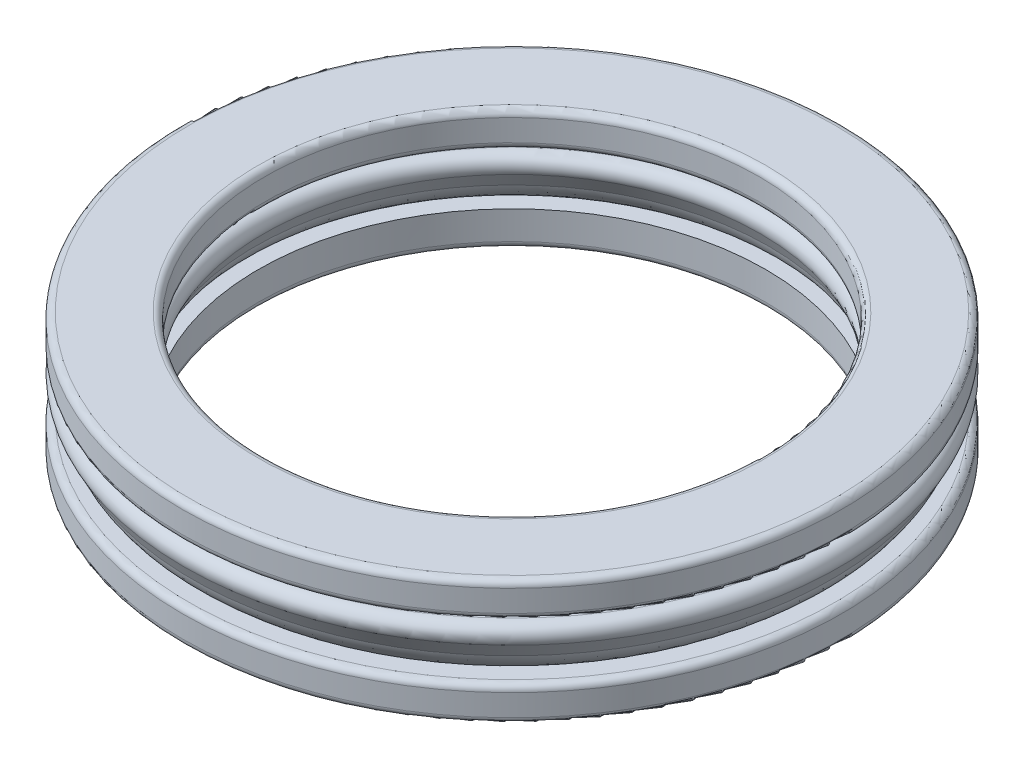
ISO-10303-21;
HEADER;
FILE_DESCRIPTION(('STEP AP214'),'2;1');
FILE_NAME('part.step','',(''),(''),'','','');
FILE_SCHEMA(('AUTOMOTIVE_DESIGN { 1 0 10303 214 1 1 1 1 }'));
ENDSEC;
DATA;
#1=APPLICATION_CONTEXT('core data for automotive mechanical design processes');
#2=APPLICATION_PROTOCOL_DEFINITION('international standard','automotive_design',2000,#1);
#3=PRODUCT_CONTEXT('',#1,'mechanical');
#4=PRODUCT('Part','Part','',(#3));
#5=PRODUCT_RELATED_PRODUCT_CATEGORY('part','',(#4));
#6=PRODUCT_DEFINITION_FORMATION('','',#4);
#7=PRODUCT_DEFINITION_CONTEXT('part definition',#1,'design');
#8=PRODUCT_DEFINITION('design','',#6,#7);
#9=PRODUCT_DEFINITION_SHAPE('','',#8);
#10=(LENGTH_UNIT() NAMED_UNIT(*) SI_UNIT(.MILLI.,.METRE.));
#11=(NAMED_UNIT(*) PLANE_ANGLE_UNIT() SI_UNIT($,.RADIAN.));
#12=(NAMED_UNIT(*) SI_UNIT($,.STERADIAN.) SOLID_ANGLE_UNIT());
#13=UNCERTAINTY_MEASURE_WITH_UNIT(LENGTH_MEASURE(1.E-05),#10,'distance_accuracy_value','');
#14=(GEOMETRIC_REPRESENTATION_CONTEXT(3) GLOBAL_UNCERTAINTY_ASSIGNED_CONTEXT((#13)) GLOBAL_UNIT_ASSIGNED_CONTEXT((#10,
#11,#12)) REPRESENTATION_CONTEXT('',''));
#15=CARTESIAN_POINT('',(0.,0.,0.));
#16=DIRECTION('',(0.,0.,1.));
#17=DIRECTION('',(1.,0.,0.));
#18=AXIS2_PLACEMENT_3D('',#15,#16,#17);
#19=CARTESIAN_POINT('',(0.,0.,0.));
#20=DIRECTION('',(0.,-1.,0.));
#21=DIRECTION('',(0.,0.,-1.));
#22=AXIS2_PLACEMENT_3D('',#19,#20,#21);
#23=CYLINDRICAL_SURFACE('',#22,50.);
#24=CARTESIAN_POINT('',(0.,1.,0.));
#25=DIRECTION('',(0.,1.,0.));
#26=DIRECTION('',(0.,0.,1.));
#27=AXIS2_PLACEMENT_3D('',#24,#25,#26);
#28=CIRCLE('',#27,50.);
#29=CARTESIAN_POINT('',(0.,1.,50.));
#30=VERTEX_POINT('',#29);
#31=EDGE_CURVE('E66',#30,#30,#28,.T.);
#32=ORIENTED_EDGE('',*,*,#31,.T.);
#33=EDGE_LOOP('',(#32));
#34=FACE_BOUND('',#33,.T.);
#35=CARTESIAN_POINT('',(0.,4.3,0.));
#36=DIRECTION('',(0.,-1.,0.));
#37=DIRECTION('',(0.,0.,-1.));
#38=AXIS2_PLACEMENT_3D('',#35,#36,#37);
#39=CIRCLE('',#38,50.);
#40=CARTESIAN_POINT('',(0.,4.3,-50.));
#41=VERTEX_POINT('',#40);
#42=EDGE_CURVE('E69',#41,#41,#39,.T.);
#43=ORIENTED_EDGE('',*,*,#42,.T.);
#44=EDGE_LOOP('',(#43));
#45=FACE_BOUND('',#44,.T.);
#46=ADVANCED_FACE('F31',(#34,#45),#23,.T.);
#47=CARTESIAN_POINT('',(-50.,0.,0.));
#48=DIRECTION('',(0.,1.,0.));
#49=DIRECTION('',(0.,0.,1.));
#50=AXIS2_PLACEMENT_3D('',#47,#48,#49);
#51=PLANE('',#50);
#52=CARTESIAN_POINT('',(0.,0.,0.));
#53=DIRECTION('',(0.,1.,0.));
#54=DIRECTION('',(0.,0.,1.));
#55=AXIS2_PLACEMENT_3D('',#52,#53,#54);
#56=CIRCLE('',#55,39.5);
#57=CARTESIAN_POINT('',(0.,0.,39.5));
#58=VERTEX_POINT('',#57);
#59=EDGE_CURVE('E72',#58,#58,#56,.T.);
#60=ORIENTED_EDGE('',*,*,#59,.T.);
#61=EDGE_LOOP('',(#60));
#62=FACE_BOUND('',#61,.T.);
#63=CARTESIAN_POINT('',(0.,0.,0.));
#64=DIRECTION('',(0.,1.,0.));
#65=DIRECTION('',(0.,0.,1.));
#66=AXIS2_PLACEMENT_3D('',#63,#64,#65);
#67=CIRCLE('',#66,49.);
#68=CARTESIAN_POINT('',(0.,0.,49.));
#69=VERTEX_POINT('',#68);
#70=EDGE_CURVE('E75',#69,#69,#67,.F.);
#71=ORIENTED_EDGE('',*,*,#70,.T.);
#72=EDGE_LOOP('',(#71));
#73=FACE_BOUND('',#72,.T.);
#74=ADVANCED_FACE('F165',(#62,#73),#51,.F.);
#75=CARTESIAN_POINT('',(0.,0.,0.));
#76=DIRECTION('',(0.,-1.,0.));
#77=DIRECTION('',(0.,0.,-1.));
#78=AXIS2_PLACEMENT_3D('',#75,#76,#77);
#79=CYLINDRICAL_SURFACE('',#78,38.5);
#80=CARTESIAN_POINT('',(0.,1.,0.));
#81=DIRECTION('',(0.,1.,0.));
#82=DIRECTION('',(0.,0.,1.));
#83=AXIS2_PLACEMENT_3D('',#80,#81,#82);
#84=CIRCLE('',#83,38.5);
#85=CARTESIAN_POINT('',(0.,1.,38.5));
#86=VERTEX_POINT('',#85);
#87=EDGE_CURVE('E78',#86,#86,#84,.F.);
#88=ORIENTED_EDGE('',*,*,#87,.T.);
#89=EDGE_LOOP('',(#88));
#90=FACE_BOUND('',#89,.T.);
#91=CARTESIAN_POINT('',(0.,5.3,0.));
#92=DIRECTION('',(0.,-1.,0.));
#93=DIRECTION('',(0.,0.,-1.));
#94=AXIS2_PLACEMENT_3D('',#91,#92,#93);
#95=CIRCLE('',#94,38.5);
#96=CARTESIAN_POINT('',(0.,5.3,-38.5));
#97=VERTEX_POINT('',#96);
#98=EDGE_CURVE('E81',#97,#97,#95,.T.);
#99=ORIENTED_EDGE('',*,*,#98,.F.);
#100=EDGE_LOOP('',(#99));
#101=FACE_BOUND('',#100,.T.);
#102=ADVANCED_FACE('F171',(#90,#101),#79,.F.);
#103=CARTESIAN_POINT('',(-41.0741076254827,5.3,0.));
#104=DIRECTION('',(0.,-1.,0.));
#105=DIRECTION('',(0.,0.,-1.));
#106=AXIS2_PLACEMENT_3D('',#103,#104,#105);
#107=PLANE('',#106);
#108=CARTESIAN_POINT('',(0.,5.3,0.));
#109=DIRECTION('',(0.,-1.,0.));
#110=DIRECTION('',(0.,0.,-1.));
#111=AXIS2_PLACEMENT_3D('',#108,#109,#110);
#112=CIRCLE('',#111,41.0741076254827);
#113=CARTESIAN_POINT('',(0.,5.3,-41.0741076254827));
#114=VERTEX_POINT('',#113);
#115=EDGE_CURVE('E84',#114,#114,#112,.T.);
#116=ORIENTED_EDGE('',*,*,#115,.F.);
#117=EDGE_LOOP('',(#116));
#118=FACE_BOUND('',#117,.T.);
#119=ORIENTED_EDGE('',*,*,#98,.T.);
#120=EDGE_LOOP('',(#119));
#121=FACE_BOUND('',#120,.T.);
#122=ADVANCED_FACE('F238',(#118,#121),#107,.F.);
#123=CARTESIAN_POINT('',(0.,9.5,0.));
#124=DIRECTION('',(0.,-1.,0.));
#125=DIRECTION('',(0.,0.,-1.));
#126=AXIS2_PLACEMENT_3D('',#123,#124,#125);
#127=TOROIDAL_SURFACE('',#126,43.75,4.98);
#128=CARTESIAN_POINT('',(0.,8.1,0.));
#129=DIRECTION('',(0.,-1.,0.));
#130=DIRECTION('',(0.,0.,-1.));
#131=AXIS2_PLACEMENT_3D('',#128,#129,#130);
#132=CIRCLE('',#131,38.9708368933463);
#133=CARTESIAN_POINT('',(0.,8.1,-38.9708368933463));
#134=VERTEX_POINT('',#133);
#135=EDGE_CURVE('E87',#134,#134,#132,.T.);
#136=ORIENTED_EDGE('',*,*,#135,.F.);
#137=EDGE_LOOP('',(#136));
#138=FACE_BOUND('',#137,.T.);
#139=ORIENTED_EDGE('',*,*,#115,.T.);
#140=EDGE_LOOP('',(#139));
#141=FACE_BOUND('',#140,.T.);
#142=ADVANCED_FACE('F234',(#138,#141),#127,.T.);
#143=CARTESIAN_POINT('',(0.,8.1,0.));
#144=DIRECTION('',(0.,-1.,0.));
#145=DIRECTION('',(0.,0.,-1.));
#146=AXIS2_PLACEMENT_3D('',#143,#144,#145);
#147=CONICAL_SURFACE('',#146,38.9708368933463,0.504861365675038);
#148=CARTESIAN_POINT('',(0.,10.3777336190306,0.));
#149=DIRECTION('',(0.,-1.,0.));
#150=DIRECTION('',(0.,0.,-1.));
#151=AXIS2_PLACEMENT_3D('',#148,#149,#150);
#152=CIRCLE('',#151,37.7120893848327);
#153=CARTESIAN_POINT('',(0.,10.3777336190306,-37.7120893848327));
#154=VERTEX_POINT('',#153);
#155=EDGE_CURVE('E90',#154,#154,#152,.T.);
#156=ORIENTED_EDGE('',*,*,#155,.F.);
#157=EDGE_LOOP('',(#156));
#158=FACE_BOUND('',#157,.T.);
#159=ORIENTED_EDGE('',*,*,#135,.T.);
#160=EDGE_LOOP('',(#159));
#161=FACE_BOUND('',#160,.T.);
#162=ADVANCED_FACE('F230',(#158,#161),#147,.F.);
#163=CARTESIAN_POINT('',(0.,11.2,0.));
#164=DIRECTION('',(0.,-1.,0.));
#165=DIRECTION('',(0.,0.,-1.));
#166=AXIS2_PLACEMENT_3D('',#163,#164,#165);
#167=TOROIDAL_SURFACE('',#166,39.2,1.69999999999999);
#168=CARTESIAN_POINT('',(0.,12.9,0.));
#169=DIRECTION('',(0.,-1.,0.));
#170=DIRECTION('',(0.,0.,-1.));
#171=AXIS2_PLACEMENT_3D('',#168,#169,#170);
#172=CIRCLE('',#171,39.2);
#173=CARTESIAN_POINT('',(0.,12.9,-39.2));
#174=VERTEX_POINT('',#173);
#175=EDGE_CURVE('E93',#174,#174,#172,.T.);
#176=ORIENTED_EDGE('',*,*,#175,.F.);
#177=EDGE_LOOP('',(#176));
#178=FACE_BOUND('',#177,.T.);
#179=ORIENTED_EDGE('',*,*,#155,.T.);
#180=EDGE_LOOP('',(#179));
#181=FACE_BOUND('',#180,.T.);
#182=ADVANCED_FACE('F226',(#178,#181),#167,.T.);
#183=CARTESIAN_POINT('',(-40.1112639557121,12.9,0.));
#184=DIRECTION('',(0.,-1.,0.));
#185=DIRECTION('',(0.,0.,-1.));
#186=AXIS2_PLACEMENT_3D('',#183,#184,#185);
#187=PLANE('',#186);
#188=CARTESIAN_POINT('',(0.,12.9,0.));
#189=DIRECTION('',(0.,-1.,0.));
#190=DIRECTION('',(0.,0.,-1.));
#191=AXIS2_PLACEMENT_3D('',#188,#189,#190);
#192=CIRCLE('',#191,40.1112639557121);
#193=CARTESIAN_POINT('',(0.,12.9,-40.1112639557121));
#194=VERTEX_POINT('',#193);
#195=EDGE_CURVE('E96',#194,#194,#192,.T.);
#196=ORIENTED_EDGE('',*,*,#195,.F.);
#197=EDGE_LOOP('',(#196));
#198=FACE_BOUND('',#197,.T.);
#199=ORIENTED_EDGE('',*,*,#175,.T.);
#200=EDGE_LOOP('',(#199));
#201=FACE_BOUND('',#200,.T.);
#202=ADVANCED_FACE('F222',(#198,#201),#187,.F.);
#203=CARTESIAN_POINT('',(0.,9.5,0.));
#204=DIRECTION('',(0.,-1.,0.));
#205=DIRECTION('',(0.,0.,-1.));
#206=AXIS2_PLACEMENT_3D('',#203,#204,#205);
#207=TOROIDAL_SURFACE('',#206,43.75,4.98);
#208=CARTESIAN_POINT('',(0.,13.7,0.));
#209=DIRECTION('',(0.,-1.,0.));
#210=DIRECTION('',(0.,0.,-1.));
#211=AXIS2_PLACEMENT_3D('',#208,#209,#210);
#212=CIRCLE('',#211,41.0741076254827);
#213=CARTESIAN_POINT('',(0.,13.7,-41.0741076254827));
#214=VERTEX_POINT('',#213);
#215=EDGE_CURVE('E99',#214,#214,#212,.T.);
#216=ORIENTED_EDGE('',*,*,#215,.F.);
#217=EDGE_LOOP('',(#216));
#218=FACE_BOUND('',#217,.T.);
#219=ORIENTED_EDGE('',*,*,#195,.T.);
#220=EDGE_LOOP('',(#219));
#221=FACE_BOUND('',#220,.T.);
#222=ADVANCED_FACE('F216',(#218,#221),#207,.T.);
#223=CARTESIAN_POINT('',(-41.0741076254827,13.7,0.));
#224=DIRECTION('',(0.,1.,0.));
#225=DIRECTION('',(0.,0.,1.));
#226=AXIS2_PLACEMENT_3D('',#223,#224,#225);
#227=PLANE('',#226);
#228=CARTESIAN_POINT('',(0.,13.7,0.));
#229=DIRECTION('',(0.,1.,0.));
#230=DIRECTION('',(0.,0.,1.));
#231=AXIS2_PLACEMENT_3D('',#228,#229,#230);
#232=CIRCLE('',#231,38.5);
#233=CARTESIAN_POINT('',(0.,13.7,38.5));
#234=VERTEX_POINT('',#233);
#235=EDGE_CURVE('E42',#234,#234,#232,.T.);
#236=ORIENTED_EDGE('',*,*,#235,.T.);
#237=EDGE_LOOP('',(#236));
#238=FACE_BOUND('',#237,.T.);
#239=ORIENTED_EDGE('',*,*,#215,.T.);
#240=EDGE_LOOP('',(#239));
#241=FACE_BOUND('',#240,.T.);
#242=ADVANCED_FACE('F208',(#238,#241),#227,.F.);
#243=CARTESIAN_POINT('',(0.,0.,0.));
#244=DIRECTION('',(0.,-1.,0.));
#245=DIRECTION('',(0.,0.,-1.));
#246=AXIS2_PLACEMENT_3D('',#243,#244,#245);
#247=CYLINDRICAL_SURFACE('',#246,37.5);
#248=CARTESIAN_POINT('',(0.,14.7,0.));
#249=DIRECTION('',(0.,1.,0.));
#250=DIRECTION('',(0.,0.,1.));
#251=AXIS2_PLACEMENT_3D('',#248,#249,#250);
#252=CIRCLE('',#251,37.5);
#253=CARTESIAN_POINT('',(0.,14.7,37.5));
#254=VERTEX_POINT('',#253);
#255=EDGE_CURVE('E46',#254,#254,#252,.F.);
#256=ORIENTED_EDGE('',*,*,#255,.T.);
#257=EDGE_LOOP('',(#256));
#258=FACE_BOUND('',#257,.T.);
#259=CARTESIAN_POINT('',(0.,18.,0.));
#260=DIRECTION('',(0.,-1.,0.));
#261=DIRECTION('',(0.,0.,-1.));
#262=AXIS2_PLACEMENT_3D('',#259,#260,#261);
#263=CIRCLE('',#262,37.5);
#264=CARTESIAN_POINT('',(0.,18.,-37.5));
#265=VERTEX_POINT('',#264);
#266=EDGE_CURVE('E51',#265,#265,#263,.F.);
#267=ORIENTED_EDGE('',*,*,#266,.T.);
#268=EDGE_LOOP('',(#267));
#269=FACE_BOUND('',#268,.T.);
#270=ADVANCED_FACE('F206',(#258,#269),#247,.F.);
#271=CARTESIAN_POINT('',(-50.,19.,0.));
#272=DIRECTION('',(0.,-1.,0.));
#273=DIRECTION('',(0.,0.,-1.));
#274=AXIS2_PLACEMENT_3D('',#271,#272,#273);
#275=PLANE('',#274);
#276=CARTESIAN_POINT('',(0.,19.,0.));
#277=DIRECTION('',(0.,-1.,0.));
#278=DIRECTION('',(0.,0.,-1.));
#279=AXIS2_PLACEMENT_3D('',#276,#277,#278);
#280=CIRCLE('',#279,38.5);
#281=CARTESIAN_POINT('',(0.,19.,-38.5));
#282=VERTEX_POINT('',#281);
#283=EDGE_CURVE('E10',#282,#282,#280,.T.);
#284=ORIENTED_EDGE('',*,*,#283,.T.);
#285=EDGE_LOOP('',(#284));
#286=FACE_BOUND('',#285,.T.);
#287=CARTESIAN_POINT('',(0.,19.,0.));
#288=DIRECTION('',(0.,-1.,0.));
#289=DIRECTION('',(0.,0.,-1.));
#290=AXIS2_PLACEMENT_3D('',#287,#288,#289);
#291=CIRCLE('',#290,49.);
#292=CARTESIAN_POINT('',(0.,19.,-49.));
#293=VERTEX_POINT('',#292);
#294=EDGE_CURVE('E38',#293,#293,#291,.F.);
#295=ORIENTED_EDGE('',*,*,#294,.T.);
#296=EDGE_LOOP('',(#295));
#297=FACE_BOUND('',#296,.T.);
#298=ADVANCED_FACE('F161',(#286,#297),#275,.F.);
#299=CARTESIAN_POINT('',(0.,0.,0.));
#300=DIRECTION('',(0.,-1.,0.));
#301=DIRECTION('',(0.,0.,-1.));
#302=AXIS2_PLACEMENT_3D('',#299,#300,#301);
#303=CYLINDRICAL_SURFACE('',#302,50.);
#304=CARTESIAN_POINT('',(0.,14.7,0.));
#305=DIRECTION('',(0.,1.,0.));
#306=DIRECTION('',(0.,0.,1.));
#307=AXIS2_PLACEMENT_3D('',#304,#305,#306);
#308=CIRCLE('',#307,50.);
#309=CARTESIAN_POINT('',(0.,14.7,50.));
#310=VERTEX_POINT('',#309);
#311=EDGE_CURVE('E54',#310,#310,#308,.T.);
#312=ORIENTED_EDGE('',*,*,#311,.T.);
#313=EDGE_LOOP('',(#312));
#314=FACE_BOUND('',#313,.T.);
#315=CARTESIAN_POINT('',(0.,18.,0.));
#316=DIRECTION('',(0.,-1.,0.));
#317=DIRECTION('',(0.,0.,-1.));
#318=AXIS2_PLACEMENT_3D('',#315,#316,#317);
#319=CIRCLE('',#318,50.);
#320=CARTESIAN_POINT('',(0.,18.,-50.));
#321=VERTEX_POINT('',#320);
#322=EDGE_CURVE('E57',#321,#321,#319,.T.);
#323=ORIENTED_EDGE('',*,*,#322,.T.);
#324=EDGE_LOOP('',(#323));
#325=FACE_BOUND('',#324,.T.);
#326=ADVANCED_FACE('F155',(#314,#325),#303,.T.);
#327=CARTESIAN_POINT('',(-50.,13.7,0.));
#328=DIRECTION('',(0.,1.,0.));
#329=DIRECTION('',(0.,0.,1.));
#330=AXIS2_PLACEMENT_3D('',#327,#328,#329);
#331=PLANE('',#330);
#332=CARTESIAN_POINT('',(0.,13.7,0.));
#333=DIRECTION('',(0.,1.,0.));
#334=DIRECTION('',(0.,0.,1.));
#335=AXIS2_PLACEMENT_3D('',#332,#333,#334);
#336=CIRCLE('',#335,49.);
#337=CARTESIAN_POINT('',(0.,13.7,49.));
#338=VERTEX_POINT('',#337);
#339=EDGE_CURVE('E60',#338,#338,#336,.F.);
#340=ORIENTED_EDGE('',*,*,#339,.T.);
#341=EDGE_LOOP('',(#340));
#342=FACE_BOUND('',#341,.T.);
#343=CARTESIAN_POINT('',(0.,13.7,0.));
#344=DIRECTION('',(0.,-1.,0.));
#345=DIRECTION('',(0.,0.,-1.));
#346=AXIS2_PLACEMENT_3D('',#343,#344,#345);
#347=CIRCLE('',#346,46.4258923745173);
#348=CARTESIAN_POINT('',(0.,13.7,-46.4258923745173));
#349=VERTEX_POINT('',#348);
#350=EDGE_CURVE('E102',#349,#349,#347,.T.);
#351=ORIENTED_EDGE('',*,*,#350,.F.);
#352=EDGE_LOOP('',(#351));
#353=FACE_BOUND('',#352,.T.);
#354=ADVANCED_FACE('F150',(#342,#353),#331,.F.);
#355=CARTESIAN_POINT('',(0.,9.5,0.));
#356=DIRECTION('',(0.,-1.,0.));
#357=DIRECTION('',(0.,0.,-1.));
#358=AXIS2_PLACEMENT_3D('',#355,#356,#357);
#359=TOROIDAL_SURFACE('',#358,43.75,4.98);
#360=CARTESIAN_POINT('',(0.,12.9,0.));
#361=DIRECTION('',(0.,-1.,0.));
#362=DIRECTION('',(0.,0.,-1.));
#363=AXIS2_PLACEMENT_3D('',#360,#361,#362);
#364=CIRCLE('',#363,47.3887360442879);
#365=CARTESIAN_POINT('',(0.,12.9,-47.3887360442879));
#366=VERTEX_POINT('',#365);
#367=EDGE_CURVE('E105',#366,#366,#364,.T.);
#368=ORIENTED_EDGE('',*,*,#367,.F.);
#369=EDGE_LOOP('',(#368));
#370=FACE_BOUND('',#369,.T.);
#371=ORIENTED_EDGE('',*,*,#350,.T.);
#372=EDGE_LOOP('',(#371));
#373=FACE_BOUND('',#372,.T.);
#374=ADVANCED_FACE('F144',(#370,#373),#359,.T.);
#375=CARTESIAN_POINT('',(-48.3,12.9,0.));
#376=DIRECTION('',(0.,-1.,0.));
#377=DIRECTION('',(0.,0.,-1.));
#378=AXIS2_PLACEMENT_3D('',#375,#376,#377);
#379=PLANE('',#378);
#380=CARTESIAN_POINT('',(0.,12.9,0.));
#381=DIRECTION('',(0.,-1.,0.));
#382=DIRECTION('',(0.,0.,-1.));
#383=AXIS2_PLACEMENT_3D('',#380,#381,#382);
#384=CIRCLE('',#383,48.3);
#385=CARTESIAN_POINT('',(0.,12.9,-48.3));
#386=VERTEX_POINT('',#385);
#387=EDGE_CURVE('E108',#386,#386,#384,.T.);
#388=ORIENTED_EDGE('',*,*,#387,.F.);
#389=EDGE_LOOP('',(#388));
#390=FACE_BOUND('',#389,.T.);
#391=ORIENTED_EDGE('',*,*,#367,.T.);
#392=EDGE_LOOP('',(#391));
#393=FACE_BOUND('',#392,.T.);
#394=ADVANCED_FACE('F138',(#390,#393),#379,.F.);
#395=CARTESIAN_POINT('',(0.,11.2,0.));
#396=DIRECTION('',(0.,-1.,0.));
#397=DIRECTION('',(0.,0.,-1.));
#398=AXIS2_PLACEMENT_3D('',#395,#396,#397);
#399=TOROIDAL_SURFACE('',#398,48.3,1.7);
#400=CARTESIAN_POINT('',(0.,10.3777336190306,0.));
#401=DIRECTION('',(0.,-1.,0.));
#402=DIRECTION('',(0.,0.,-1.));
#403=AXIS2_PLACEMENT_3D('',#400,#401,#402);
#404=CIRCLE('',#403,49.7879106151673);
#405=CARTESIAN_POINT('',(0.,10.3777336190306,-49.7879106151673));
#406=VERTEX_POINT('',#405);
#407=EDGE_CURVE('E111',#406,#406,#404,.T.);
#408=ORIENTED_EDGE('',*,*,#407,.F.);
#409=EDGE_LOOP('',(#408));
#410=FACE_BOUND('',#409,.T.);
#411=ORIENTED_EDGE('',*,*,#387,.T.);
#412=EDGE_LOOP('',(#411));
#413=FACE_BOUND('',#412,.T.);
#414=ADVANCED_FACE('F132',(#410,#413),#399,.T.);
#415=CARTESIAN_POINT('',(0.,10.3777336190306,0.));
#416=DIRECTION('',(0.,1.,0.));
#417=DIRECTION('',(0.,0.,1.));
#418=AXIS2_PLACEMENT_3D('',#415,#416,#417);
#419=CONICAL_SURFACE('',#418,49.7879106151673,0.504861365675044);
#420=CARTESIAN_POINT('',(0.,8.1,0.));
#421=DIRECTION('',(0.,-1.,0.));
#422=DIRECTION('',(0.,0.,-1.));
#423=AXIS2_PLACEMENT_3D('',#420,#421,#422);
#424=CIRCLE('',#423,48.5291631066537);
#425=CARTESIAN_POINT('',(0.,8.1,-48.5291631066537));
#426=VERTEX_POINT('',#425);
#427=EDGE_CURVE('E114',#426,#426,#424,.T.);
#428=ORIENTED_EDGE('',*,*,#427,.F.);
#429=EDGE_LOOP('',(#428));
#430=FACE_BOUND('',#429,.T.);
#431=ORIENTED_EDGE('',*,*,#407,.T.);
#432=EDGE_LOOP('',(#431));
#433=FACE_BOUND('',#432,.T.);
#434=ADVANCED_FACE('F126',(#430,#433),#419,.T.);
#435=CARTESIAN_POINT('',(0.,9.5,0.));
#436=DIRECTION('',(0.,-1.,0.));
#437=DIRECTION('',(0.,0.,-1.));
#438=AXIS2_PLACEMENT_3D('',#435,#436,#437);
#439=TOROIDAL_SURFACE('',#438,43.75,4.98);
#440=CARTESIAN_POINT('',(0.,5.3,0.));
#441=DIRECTION('',(0.,-1.,0.));
#442=DIRECTION('',(0.,0.,-1.));
#443=AXIS2_PLACEMENT_3D('',#440,#441,#442);
#444=CIRCLE('',#443,46.4258923745173);
#445=CARTESIAN_POINT('',(0.,5.3,-46.4258923745173));
#446=VERTEX_POINT('',#445);
#447=EDGE_CURVE('E117',#446,#446,#444,.T.);
#448=ORIENTED_EDGE('',*,*,#447,.F.);
#449=EDGE_LOOP('',(#448));
#450=FACE_BOUND('',#449,.T.);
#451=ORIENTED_EDGE('',*,*,#427,.T.);
#452=EDGE_LOOP('',(#451));
#453=FACE_BOUND('',#452,.T.);
#454=ADVANCED_FACE('F123',(#450,#453),#439,.T.);
#455=CARTESIAN_POINT('',(-50.,5.3,0.));
#456=DIRECTION('',(0.,-1.,0.));
#457=DIRECTION('',(0.,0.,-1.));
#458=AXIS2_PLACEMENT_3D('',#455,#456,#457);
#459=PLANE('',#458);
#460=CARTESIAN_POINT('',(0.,5.3,0.));
#461=DIRECTION('',(0.,-1.,0.));
#462=DIRECTION('',(0.,0.,-1.));
#463=AXIS2_PLACEMENT_3D('',#460,#461,#462);
#464=CIRCLE('',#463,49.);
#465=CARTESIAN_POINT('',(0.,5.3,-49.));
#466=VERTEX_POINT('',#465);
#467=EDGE_CURVE('E63',#466,#466,#464,.F.);
#468=ORIENTED_EDGE('',*,*,#467,.T.);
#469=EDGE_LOOP('',(#468));
#470=FACE_BOUND('',#469,.T.);
#471=ORIENTED_EDGE('',*,*,#447,.T.);
#472=EDGE_LOOP('',(#471));
#473=FACE_BOUND('',#472,.T.);
#474=ADVANCED_FACE('F121',(#470,#473),#459,.F.);
#475=CARTESIAN_POINT('',(0.,1.,0.));
#476=DIRECTION('',(0.,1.,0.));
#477=DIRECTION('',(0.,0.,1.));
#478=AXIS2_PLACEMENT_3D('',#475,#476,#477);
#479=TOROIDAL_SURFACE('',#478,39.5,1.);
#480=ORIENTED_EDGE('',*,*,#59,.F.);
#481=EDGE_LOOP('',(#480));
#482=FACE_BOUND('',#481,.T.);
#483=ORIENTED_EDGE('',*,*,#87,.F.);
#484=EDGE_LOOP('',(#483));
#485=FACE_BOUND('',#484,.T.);
#486=ADVANCED_FACE('F177',(#482,#485),#479,.T.);
#487=CARTESIAN_POINT('',(0.,1.,0.));
#488=DIRECTION('',(0.,1.,0.));
#489=DIRECTION('',(0.,0.,1.));
#490=AXIS2_PLACEMENT_3D('',#487,#488,#489);
#491=TOROIDAL_SURFACE('',#490,49.,1.);
#492=ORIENTED_EDGE('',*,*,#31,.F.);
#493=EDGE_LOOP('',(#492));
#494=FACE_BOUND('',#493,.T.);
#495=ORIENTED_EDGE('',*,*,#70,.F.);
#496=EDGE_LOOP('',(#495));
#497=FACE_BOUND('',#496,.T.);
#498=ADVANCED_FACE('F180',(#494,#497),#491,.T.);
#499=CARTESIAN_POINT('',(0.,4.3,0.));
#500=DIRECTION('',(0.,-1.,0.));
#501=DIRECTION('',(0.,0.,-1.));
#502=AXIS2_PLACEMENT_3D('',#499,#500,#501);
#503=TOROIDAL_SURFACE('',#502,49.,1.);
#504=ORIENTED_EDGE('',*,*,#467,.F.);
#505=EDGE_LOOP('',(#504));
#506=FACE_BOUND('',#505,.T.);
#507=ORIENTED_EDGE('',*,*,#42,.F.);
#508=EDGE_LOOP('',(#507));
#509=FACE_BOUND('',#508,.T.);
#510=ADVANCED_FACE('F184',(#506,#509),#503,.T.);
#511=CARTESIAN_POINT('',(0.,14.7,0.));
#512=DIRECTION('',(0.,1.,0.));
#513=DIRECTION('',(0.,0.,1.));
#514=AXIS2_PLACEMENT_3D('',#511,#512,#513);
#515=TOROIDAL_SURFACE('',#514,49.,1.);
#516=ORIENTED_EDGE('',*,*,#311,.F.);
#517=EDGE_LOOP('',(#516));
#518=FACE_BOUND('',#517,.T.);
#519=ORIENTED_EDGE('',*,*,#339,.F.);
#520=EDGE_LOOP('',(#519));
#521=FACE_BOUND('',#520,.T.);
#522=ADVANCED_FACE('F188',(#518,#521),#515,.T.);
#523=CARTESIAN_POINT('',(0.,14.7,0.));
#524=DIRECTION('',(0.,1.,0.));
#525=DIRECTION('',(0.,0.,1.));
#526=AXIS2_PLACEMENT_3D('',#523,#524,#525);
#527=TOROIDAL_SURFACE('',#526,38.5,1.);
#528=ORIENTED_EDGE('',*,*,#235,.F.);
#529=EDGE_LOOP('',(#528));
#530=FACE_BOUND('',#529,.T.);
#531=ORIENTED_EDGE('',*,*,#255,.F.);
#532=EDGE_LOOP('',(#531));
#533=FACE_BOUND('',#532,.T.);
#534=ADVANCED_FACE('F192',(#530,#533),#527,.T.);
#535=CARTESIAN_POINT('',(0.,18.,0.));
#536=DIRECTION('',(0.,-1.,0.));
#537=DIRECTION('',(0.,0.,-1.));
#538=AXIS2_PLACEMENT_3D('',#535,#536,#537);
#539=TOROIDAL_SURFACE('',#538,38.5,1.);
#540=ORIENTED_EDGE('',*,*,#266,.F.);
#541=EDGE_LOOP('',(#540));
#542=FACE_BOUND('',#541,.T.);
#543=ORIENTED_EDGE('',*,*,#283,.F.);
#544=EDGE_LOOP('',(#543));
#545=FACE_BOUND('',#544,.T.);
#546=ADVANCED_FACE('F195',(#542,#545),#539,.T.);
#547=CARTESIAN_POINT('',(0.,18.,0.));
#548=DIRECTION('',(0.,-1.,0.));
#549=DIRECTION('',(0.,0.,-1.));
#550=AXIS2_PLACEMENT_3D('',#547,#548,#549);
#551=TOROIDAL_SURFACE('',#550,49.,1.);
#552=ORIENTED_EDGE('',*,*,#294,.F.);
#553=EDGE_LOOP('',(#552));
#554=FACE_BOUND('',#553,.T.);
#555=ORIENTED_EDGE('',*,*,#322,.F.);
#556=EDGE_LOOP('',(#555));
#557=FACE_BOUND('',#556,.T.);
#558=ADVANCED_FACE('F33',(#554,#557),#551,.T.);
#559=CLOSED_SHELL('',(#46,#74,#102,#122,#142,#162,#182,#202,#222,#242,#270,#298,#326,#354,#374,
#394,#414,#434,#454,#474,#486,#498,#510,#522,#534,#546,#558));
#560=MANIFOLD_SOLID_BREP('B2',#559);
#561=ADVANCED_BREP_SHAPE_REPRESENTATION('',(#18,#560),#14);
#562=SHAPE_DEFINITION_REPRESENTATION(#9,#561);
ENDSEC;
END-ISO-10303-21;
